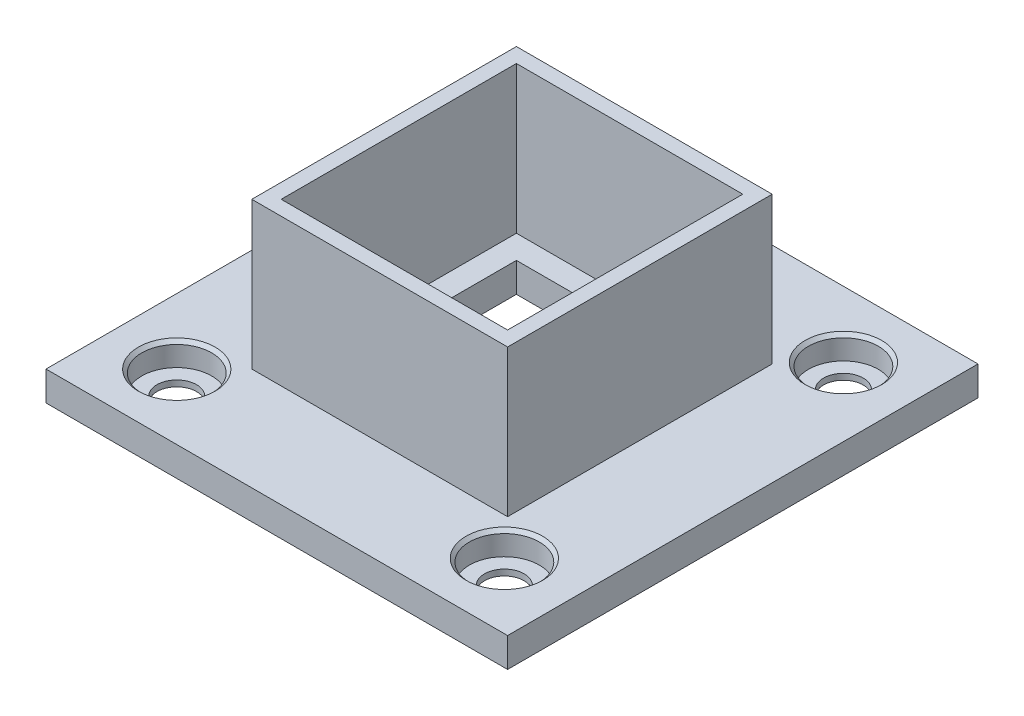
ISO-10303-21;
HEADER;
FILE_DESCRIPTION(('STEP AP214'),'2;1');
FILE_NAME('part.step','',(''),(''),'','','');
FILE_SCHEMA(('AUTOMOTIVE_DESIGN { 1 0 10303 214 1 1 1 1 }'));
ENDSEC;
DATA;
#1=APPLICATION_CONTEXT('core data for automotive mechanical design processes');
#2=APPLICATION_PROTOCOL_DEFINITION('international standard','automotive_design',2000,#1);
#3=PRODUCT_CONTEXT('',#1,'mechanical');
#4=PRODUCT('Part','Part','',(#3));
#5=PRODUCT_RELATED_PRODUCT_CATEGORY('part','',(#4));
#6=PRODUCT_DEFINITION_FORMATION('','',#4);
#7=PRODUCT_DEFINITION_CONTEXT('part definition',#1,'design');
#8=PRODUCT_DEFINITION('design','',#6,#7);
#9=PRODUCT_DEFINITION_SHAPE('','',#8);
#10=(LENGTH_UNIT() NAMED_UNIT(*) SI_UNIT(.MILLI.,.METRE.));
#11=(NAMED_UNIT(*) PLANE_ANGLE_UNIT() SI_UNIT($,.RADIAN.));
#12=(NAMED_UNIT(*) SI_UNIT($,.STERADIAN.) SOLID_ANGLE_UNIT());
#13=UNCERTAINTY_MEASURE_WITH_UNIT(LENGTH_MEASURE(1.E-05),#10,'distance_accuracy_value','');
#14=(GEOMETRIC_REPRESENTATION_CONTEXT(3) GLOBAL_UNCERTAINTY_ASSIGNED_CONTEXT((#13)) GLOBAL_UNIT_ASSIGNED_CONTEXT((#10,
#11,#12)) REPRESENTATION_CONTEXT('',''));
#15=CARTESIAN_POINT('',(0.,0.,0.));
#16=DIRECTION('',(0.,0.,1.));
#17=DIRECTION('',(1.,0.,0.));
#18=AXIS2_PLACEMENT_3D('',#15,#16,#17);
#19=CARTESIAN_POINT('',(0.,10.,0.));
#20=DIRECTION('',(0.,1.,0.));
#21=DIRECTION('',(0.,0.,1.));
#22=AXIS2_PLACEMENT_3D('',#19,#20,#21);
#23=PLANE('',#22);
#24=DIRECTION('',(0.,0.,1.));
#25=VECTOR('',#24,1.);
#26=CARTESIAN_POINT('',(-32.1468531468532,10.,-21.7167832167832));
#27=LINE('',#26,#25);
#28=CARTESIAN_POINT('',(-32.1468531468532,10.,-21.7167832167832));
#29=VERTEX_POINT('',#28);
#30=CARTESIAN_POINT('',(-32.1468531468532,10.,42.2832167832168));
#31=VERTEX_POINT('',#30);
#32=EDGE_CURVE('E305',#29,#31,#27,.T.);
#33=ORIENTED_EDGE('',*,*,#32,.F.);
#34=DIRECTION('',(-1.,0.,0.));
#35=VECTOR('',#34,1.);
#36=CARTESIAN_POINT('',(-32.1468531468532,10.,-21.7167832167832));
#37=LINE('',#36,#35);
#38=CARTESIAN_POINT('',(28.8531468531469,10.,-21.7167832167832));
#39=VERTEX_POINT('',#38);
#40=EDGE_CURVE('E295',#39,#29,#37,.T.);
#41=ORIENTED_EDGE('',*,*,#40,.F.);
#42=DIRECTION('',(0.,0.,-1.));
#43=VECTOR('',#42,1.);
#44=CARTESIAN_POINT('',(28.8531468531469,10.,-21.7167832167832));
#45=LINE('',#44,#43);
#46=CARTESIAN_POINT('',(28.8531468531469,10.,42.2832167832168));
#47=VERTEX_POINT('',#46);
#48=EDGE_CURVE('E310',#47,#39,#45,.T.);
#49=ORIENTED_EDGE('',*,*,#48,.F.);
#50=DIRECTION('',(1.,0.,0.));
#51=VECTOR('',#50,1.);
#52=CARTESIAN_POINT('',(-32.1468531468532,10.,42.2832167832168));
#53=LINE('',#52,#51);
#54=EDGE_CURVE('E307',#31,#47,#53,.T.);
#55=ORIENTED_EDGE('',*,*,#54,.F.);
#56=EDGE_LOOP('',(#33,#41,#49,#55));
#57=FACE_BOUND('',#56,.T.);
#58=DIRECTION('',(0.,0.,1.));
#59=VECTOR('',#58,1.);
#60=CARTESIAN_POINT('',(36.8531468531469,10.,-29.7167832167832));
#61=LINE('',#60,#59);
#62=CARTESIAN_POINT('',(36.8531468531469,10.,-29.7167832167832));
#63=VERTEX_POINT('',#62);
#64=CARTESIAN_POINT('',(36.8531468531469,10.,50.2832167832168));
#65=VERTEX_POINT('',#64);
#66=EDGE_CURVE('E204',#63,#65,#61,.T.);
#67=ORIENTED_EDGE('',*,*,#66,.F.);
#68=DIRECTION('',(1.,0.,0.));
#69=VECTOR('',#68,1.);
#70=CARTESIAN_POINT('',(-40.1468531468532,10.,-29.7167832167832));
#71=LINE('',#70,#69);
#72=CARTESIAN_POINT('',(-40.1468531468532,10.,-29.7167832167832));
#73=VERTEX_POINT('',#72);
#74=EDGE_CURVE('E178',#73,#63,#71,.T.);
#75=ORIENTED_EDGE('',*,*,#74,.F.);
#76=DIRECTION('',(0.,0.,1.));
#77=VECTOR('',#76,1.);
#78=CARTESIAN_POINT('',(-40.1468531468532,10.,-29.7167832167832));
#79=LINE('',#78,#77);
#80=CARTESIAN_POINT('',(-40.1468531468532,10.,50.2832167832168));
#81=VERTEX_POINT('',#80);
#82=EDGE_CURVE('E195',#73,#81,#79,.T.);
#83=ORIENTED_EDGE('',*,*,#82,.T.);
#84=DIRECTION('',(1.,0.,0.));
#85=VECTOR('',#84,1.);
#86=CARTESIAN_POINT('',(-40.1468531468532,10.,50.2832167832168));
#87=LINE('',#86,#85);
#88=EDGE_CURVE('E198',#81,#65,#87,.T.);
#89=ORIENTED_EDGE('',*,*,#88,.T.);
#90=EDGE_LOOP('',(#67,#75,#83,#89));
#91=FACE_BOUND('',#90,.T.);
#92=ADVANCED_FACE('F58',(#57,#91),#23,.T.);
#93=CARTESIAN_POINT('',(-80.1468531468532,10.,-69.7167832167832));
#94=DIRECTION('',(1.,0.,0.));
#95=DIRECTION('',(0.,0.,-1.));
#96=AXIS2_PLACEMENT_3D('',#93,#94,#95);
#97=PLANE('',#96);
#98=DIRECTION('',(0.,0.,1.));
#99=VECTOR('',#98,1.);
#100=CARTESIAN_POINT('',(-80.1468531468532,0.,-69.7167832167832));
#101=LINE('',#100,#99);
#102=CARTESIAN_POINT('',(-80.1468531468532,0.,-69.7167832167832));
#103=VERTEX_POINT('',#102);
#104=CARTESIAN_POINT('',(-80.1468531468531,0.,90.2832167832168));
#105=VERTEX_POINT('',#104);
#106=EDGE_CURVE('E317',#103,#105,#101,.T.);
#107=ORIENTED_EDGE('',*,*,#106,.T.);
#108=DIRECTION('',(0.,-1.,0.));
#109=VECTOR('',#108,1.);
#110=CARTESIAN_POINT('',(-80.1468531468531,10.,90.2832167832168));
#111=LINE('',#110,#109);
#112=CARTESIAN_POINT('',(-80.1468531468531,10.,90.2832167832168));
#113=VERTEX_POINT('',#112);
#114=EDGE_CURVE('E12',#113,#105,#111,.T.);
#115=ORIENTED_EDGE('',*,*,#114,.F.);
#116=DIRECTION('',(0.,0.,1.));
#117=VECTOR('',#116,1.);
#118=CARTESIAN_POINT('',(-80.1468531468532,10.,-69.7167832167832));
#119=LINE('',#118,#117);
#120=CARTESIAN_POINT('',(-80.1468531468532,10.,-69.7167832167832));
#121=VERTEX_POINT('',#120);
#122=EDGE_CURVE('E324',#121,#113,#119,.T.);
#123=ORIENTED_EDGE('',*,*,#122,.F.);
#124=DIRECTION('',(0.,-1.,0.));
#125=VECTOR('',#124,1.);
#126=CARTESIAN_POINT('',(-80.1468531468532,10.,-69.7167832167832));
#127=LINE('',#126,#125);
#128=EDGE_CURVE('E334',#121,#103,#127,.T.);
#129=ORIENTED_EDGE('',*,*,#128,.T.);
#130=EDGE_LOOP('',(#107,#115,#123,#129));
#131=FACE_BOUND('',#130,.T.);
#132=ADVANCED_FACE('F60',(#131),#97,.F.);
#133=CARTESIAN_POINT('',(-80.1468531468531,10.,90.2832167832168));
#134=DIRECTION('',(0.,0.,-1.));
#135=DIRECTION('',(-1.,0.,0.));
#136=AXIS2_PLACEMENT_3D('',#133,#134,#135);
#137=PLANE('',#136);
#138=DIRECTION('',(1.,0.,0.));
#139=VECTOR('',#138,1.);
#140=CARTESIAN_POINT('',(-80.1468531468531,0.,90.2832167832168));
#141=LINE('',#140,#139);
#142=CARTESIAN_POINT('',(76.8531468531469,0.,90.2832167832168));
#143=VERTEX_POINT('',#142);
#144=EDGE_CURVE('E337',#105,#143,#141,.T.);
#145=ORIENTED_EDGE('',*,*,#144,.T.);
#146=DIRECTION('',(0.,-1.,0.));
#147=VECTOR('',#146,1.);
#148=CARTESIAN_POINT('',(76.8531468531469,10.,90.2832167832168));
#149=LINE('',#148,#147);
#150=CARTESIAN_POINT('',(76.8531468531469,10.,90.2832167832168));
#151=VERTEX_POINT('',#150);
#152=EDGE_CURVE('E67',#151,#143,#149,.T.);
#153=ORIENTED_EDGE('',*,*,#152,.F.);
#154=DIRECTION('',(1.,0.,0.));
#155=VECTOR('',#154,1.);
#156=CARTESIAN_POINT('',(-80.1468531468531,10.,90.2832167832168));
#157=LINE('',#156,#155);
#158=EDGE_CURVE('E327',#113,#151,#157,.T.);
#159=ORIENTED_EDGE('',*,*,#158,.F.);
#160=ORIENTED_EDGE('',*,*,#114,.T.);
#161=EDGE_LOOP('',(#145,#153,#159,#160));
#162=FACE_BOUND('',#161,.T.);
#163=ADVANCED_FACE('F381',(#162),#137,.F.);
#164=CARTESIAN_POINT('',(76.8531468531469,10.,-69.7167832167832));
#165=DIRECTION('',(-1.,0.,0.));
#166=DIRECTION('',(0.,0.,1.));
#167=AXIS2_PLACEMENT_3D('',#164,#165,#166);
#168=PLANE('',#167);
#169=DIRECTION('',(0.,0.,-1.));
#170=VECTOR('',#169,1.);
#171=CARTESIAN_POINT('',(76.8531468531469,0.,-69.7167832167832));
#172=LINE('',#171,#170);
#173=CARTESIAN_POINT('',(76.8531468531469,0.,-69.7167832167832));
#174=VERTEX_POINT('',#173);
#175=EDGE_CURVE('E339',#143,#174,#172,.T.);
#176=ORIENTED_EDGE('',*,*,#175,.T.);
#177=DIRECTION('',(0.,-1.,0.));
#178=VECTOR('',#177,1.);
#179=CARTESIAN_POINT('',(76.8531468531469,10.,-69.7167832167832));
#180=LINE('',#179,#178);
#181=CARTESIAN_POINT('',(76.8531468531469,10.,-69.7167832167832));
#182=VERTEX_POINT('',#181);
#183=EDGE_CURVE('E344',#182,#174,#180,.T.);
#184=ORIENTED_EDGE('',*,*,#183,.F.);
#185=DIRECTION('',(0.,0.,-1.));
#186=VECTOR('',#185,1.);
#187=CARTESIAN_POINT('',(76.8531468531469,10.,-69.7167832167832));
#188=LINE('',#187,#186);
#189=EDGE_CURVE('E330',#151,#182,#188,.T.);
#190=ORIENTED_EDGE('',*,*,#189,.F.);
#191=ORIENTED_EDGE('',*,*,#152,.T.);
#192=EDGE_LOOP('',(#176,#184,#190,#191));
#193=FACE_BOUND('',#192,.T.);
#194=ADVANCED_FACE('F395',(#193),#168,.F.);
#195=CARTESIAN_POINT('',(-80.1468531468532,10.,-69.7167832167832));
#196=DIRECTION('',(0.,0.,1.));
#197=DIRECTION('',(1.,0.,0.));
#198=AXIS2_PLACEMENT_3D('',#195,#196,#197);
#199=PLANE('',#198);
#200=DIRECTION('',(-1.,0.,0.));
#201=VECTOR('',#200,1.);
#202=CARTESIAN_POINT('',(-80.1468531468532,0.,-69.7167832167832));
#203=LINE('',#202,#201);
#204=EDGE_CURVE('E328',#174,#103,#203,.T.);
#205=ORIENTED_EDGE('',*,*,#204,.T.);
#206=ORIENTED_EDGE('',*,*,#128,.F.);
#207=DIRECTION('',(-1.,0.,0.));
#208=VECTOR('',#207,1.);
#209=CARTESIAN_POINT('',(-80.1468531468532,10.,-69.7167832167832));
#210=LINE('',#209,#208);
#211=EDGE_CURVE('E332',#182,#121,#210,.T.);
#212=ORIENTED_EDGE('',*,*,#211,.F.);
#213=ORIENTED_EDGE('',*,*,#183,.T.);
#214=EDGE_LOOP('',(#205,#206,#212,#213));
#215=FACE_BOUND('',#214,.T.);
#216=ADVANCED_FACE('F388',(#215),#199,.F.);
#217=DIRECTION('',(1.,0.,0.));
#218=VECTOR('',#217,1.);
#219=CARTESIAN_POINT('',(0.,10.,-34.7167832167832));
#220=LINE('',#219,#218);
#221=CARTESIAN_POINT('',(-45.1468531468532,10.,-34.7167832167832));
#222=VERTEX_POINT('',#221);
#223=CARTESIAN_POINT('',(41.8531468531469,10.,-34.7167832167832));
#224=VERTEX_POINT('',#223);
#225=EDGE_CURVE('E210',#222,#224,#220,.T.);
#226=ORIENTED_EDGE('',*,*,#225,.T.);
#227=DIRECTION('',(0.,0.,1.));
#228=VECTOR('',#227,1.);
#229=CARTESIAN_POINT('',(41.8531468531469,10.,0.));
#230=LINE('',#229,#228);
#231=CARTESIAN_POINT('',(41.8531468531469,10.,55.2832167832168));
#232=VERTEX_POINT('',#231);
#233=EDGE_CURVE('E226',#224,#232,#230,.T.);
#234=ORIENTED_EDGE('',*,*,#233,.T.);
#235=DIRECTION('',(1.,0.,0.));
#236=VECTOR('',#235,1.);
#237=CARTESIAN_POINT('',(0.,10.,55.2832167832168));
#238=LINE('',#237,#236);
#239=CARTESIAN_POINT('',(-45.1468531468531,10.,55.2832167832168));
#240=VERTEX_POINT('',#239);
#241=EDGE_CURVE('E80',#240,#232,#238,.T.);
#242=ORIENTED_EDGE('',*,*,#241,.F.);
#243=DIRECTION('',(0.,0.,1.));
#244=VECTOR('',#243,1.);
#245=CARTESIAN_POINT('',(-45.1468531468532,10.,0.));
#246=LINE('',#245,#244);
#247=EDGE_CURVE('E75',#222,#240,#246,.T.);
#248=ORIENTED_EDGE('',*,*,#247,.F.);
#249=EDGE_LOOP('',(#226,#234,#242,#248));
#250=FACE_BOUND('',#249,.T.);
#251=CARTESIAN_POINT('',(-57.8778207814317,10.,-47.2493936206808));
#252=DIRECTION('',(0.,1.,0.));
#253=DIRECTION('',(0.,0.,1.));
#254=AXIS2_PLACEMENT_3D('',#251,#252,#253);
#255=CIRCLE('',#254,13.025);
#256=CARTESIAN_POINT('',(-57.8778207814317,10.,-34.2243936206808));
#257=VERTEX_POINT('',#256);
#258=EDGE_CURVE('E232',#257,#257,#255,.T.);
#259=ORIENTED_EDGE('',*,*,#258,.F.);
#260=EDGE_LOOP('',(#259));
#261=FACE_BOUND('',#260,.T.);
#262=CARTESIAN_POINT('',(53.5428002722703,10.,-47.2493936206808));
#263=DIRECTION('',(0.,1.,0.));
#264=DIRECTION('',(0.,0.,1.));
#265=AXIS2_PLACEMENT_3D('',#262,#263,#264);
#266=CIRCLE('',#265,13.025);
#267=CARTESIAN_POINT('',(53.5428002722703,10.,-34.2243936206808));
#268=VERTEX_POINT('',#267);
#269=EDGE_CURVE('E252',#268,#268,#266,.T.);
#270=ORIENTED_EDGE('',*,*,#269,.F.);
#271=EDGE_LOOP('',(#270));
#272=FACE_BOUND('',#271,.T.);
#273=CARTESIAN_POINT('',(53.5428002722703,10.,68.076155740978));
#274=DIRECTION('',(0.,1.,0.));
#275=DIRECTION('',(0.,0.,1.));
#276=AXIS2_PLACEMENT_3D('',#273,#274,#275);
#277=CIRCLE('',#276,13.025);
#278=CARTESIAN_POINT('',(53.5428002722703,10.,81.101155740978));
#279=VERTEX_POINT('',#278);
#280=EDGE_CURVE('E265',#279,#279,#277,.T.);
#281=ORIENTED_EDGE('',*,*,#280,.F.);
#282=EDGE_LOOP('',(#281));
#283=FACE_BOUND('',#282,.T.);
#284=CARTESIAN_POINT('',(-57.8778207814317,10.,68.076155740978));
#285=DIRECTION('',(0.,1.,0.));
#286=DIRECTION('',(0.,0.,1.));
#287=AXIS2_PLACEMENT_3D('',#284,#285,#286);
#288=CIRCLE('',#287,13.025);
#289=CARTESIAN_POINT('',(-57.8778207814317,10.,81.101155740978));
#290=VERTEX_POINT('',#289);
#291=EDGE_CURVE('E278',#290,#290,#288,.T.);
#292=ORIENTED_EDGE('',*,*,#291,.F.);
#293=EDGE_LOOP('',(#292));
#294=FACE_BOUND('',#293,.T.);
#295=ORIENTED_EDGE('',*,*,#122,.T.);
#296=ORIENTED_EDGE('',*,*,#158,.T.);
#297=ORIENTED_EDGE('',*,*,#189,.T.);
#298=ORIENTED_EDGE('',*,*,#211,.T.);
#299=EDGE_LOOP('',(#295,#296,#297,#298));
#300=FACE_BOUND('',#299,.T.);
#301=ADVANCED_FACE('F377',(#250,#261,#272,#283,#294,#300),#23,.T.);
#302=CARTESIAN_POINT('',(0.,0.,0.));
#303=DIRECTION('',(0.,1.,0.));
#304=DIRECTION('',(0.,0.,1.));
#305=AXIS2_PLACEMENT_3D('',#302,#303,#304);
#306=PLANE('',#305);
#307=CARTESIAN_POINT('',(-57.8778207814317,0.,-47.2493936206808));
#308=DIRECTION('',(0.,1.,0.));
#309=DIRECTION('',(0.,0.,1.));
#310=AXIS2_PLACEMENT_3D('',#307,#308,#309);
#311=CIRCLE('',#310,6.75);
#312=CARTESIAN_POINT('',(-57.8778207814317,0.,-40.4993936206808));
#313=VERTEX_POINT('',#312);
#314=EDGE_CURVE('E62',#313,#313,#311,.T.);
#315=ORIENTED_EDGE('',*,*,#314,.T.);
#316=EDGE_LOOP('',(#315));
#317=FACE_BOUND('',#316,.T.);
#318=CARTESIAN_POINT('',(53.5428002722703,0.,-47.2493936206808));
#319=DIRECTION('',(0.,1.,0.));
#320=DIRECTION('',(0.,0.,1.));
#321=AXIS2_PLACEMENT_3D('',#318,#319,#320);
#322=CIRCLE('',#321,6.75);
#323=CARTESIAN_POINT('',(53.5428002722703,0.,-40.4993936206808));
#324=VERTEX_POINT('',#323);
#325=EDGE_CURVE('E264',#324,#324,#322,.T.);
#326=ORIENTED_EDGE('',*,*,#325,.T.);
#327=EDGE_LOOP('',(#326));
#328=FACE_BOUND('',#327,.T.);
#329=CARTESIAN_POINT('',(53.5428002722703,0.,68.076155740978));
#330=DIRECTION('',(0.,1.,0.));
#331=DIRECTION('',(0.,0.,1.));
#332=AXIS2_PLACEMENT_3D('',#329,#330,#331);
#333=CIRCLE('',#332,6.75);
#334=CARTESIAN_POINT('',(53.5428002722703,0.,74.826155740978));
#335=VERTEX_POINT('',#334);
#336=EDGE_CURVE('E277',#335,#335,#333,.T.);
#337=ORIENTED_EDGE('',*,*,#336,.T.);
#338=EDGE_LOOP('',(#337));
#339=FACE_BOUND('',#338,.T.);
#340=CARTESIAN_POINT('',(-57.8778207814317,0.,68.076155740978));
#341=DIRECTION('',(0.,1.,0.));
#342=DIRECTION('',(0.,0.,1.));
#343=AXIS2_PLACEMENT_3D('',#340,#341,#342);
#344=CIRCLE('',#343,6.75);
#345=CARTESIAN_POINT('',(-57.8778207814317,0.,74.826155740978));
#346=VERTEX_POINT('',#345);
#347=EDGE_CURVE('E290',#346,#346,#344,.T.);
#348=ORIENTED_EDGE('',*,*,#347,.T.);
#349=EDGE_LOOP('',(#348));
#350=FACE_BOUND('',#349,.T.);
#351=DIRECTION('',(-1.,0.,0.));
#352=VECTOR('',#351,1.);
#353=CARTESIAN_POINT('',(-32.1468531468532,0.,-21.7167832167832));
#354=LINE('',#353,#352);
#355=CARTESIAN_POINT('',(28.8531468531469,0.,-21.7167832167832));
#356=VERTEX_POINT('',#355);
#357=CARTESIAN_POINT('',(-32.1468531468532,0.,-21.7167832167832));
#358=VERTEX_POINT('',#357);
#359=EDGE_CURVE('E301',#356,#358,#354,.T.);
#360=ORIENTED_EDGE('',*,*,#359,.T.);
#361=DIRECTION('',(0.,0.,1.));
#362=VECTOR('',#361,1.);
#363=CARTESIAN_POINT('',(-32.1468531468532,0.,-21.7167832167832));
#364=LINE('',#363,#362);
#365=CARTESIAN_POINT('',(-32.1468531468532,0.,42.2832167832168));
#366=VERTEX_POINT('',#365);
#367=EDGE_CURVE('E291',#358,#366,#364,.T.);
#368=ORIENTED_EDGE('',*,*,#367,.T.);
#369=DIRECTION('',(1.,0.,0.));
#370=VECTOR('',#369,1.);
#371=CARTESIAN_POINT('',(-32.1468531468532,0.,42.2832167832168));
#372=LINE('',#371,#370);
#373=CARTESIAN_POINT('',(28.8531468531469,0.,42.2832167832168));
#374=VERTEX_POINT('',#373);
#375=EDGE_CURVE('E294',#366,#374,#372,.T.);
#376=ORIENTED_EDGE('',*,*,#375,.T.);
#377=DIRECTION('',(0.,0.,-1.));
#378=VECTOR('',#377,1.);
#379=CARTESIAN_POINT('',(28.8531468531469,0.,-21.7167832167832));
#380=LINE('',#379,#378);
#381=EDGE_CURVE('E298',#374,#356,#380,.T.);
#382=ORIENTED_EDGE('',*,*,#381,.T.);
#383=EDGE_LOOP('',(#360,#368,#376,#382));
#384=FACE_BOUND('',#383,.T.);
#385=ORIENTED_EDGE('',*,*,#106,.F.);
#386=ORIENTED_EDGE('',*,*,#204,.F.);
#387=ORIENTED_EDGE('',*,*,#175,.F.);
#388=ORIENTED_EDGE('',*,*,#144,.F.);
#389=EDGE_LOOP('',(#385,#386,#387,#388));
#390=FACE_BOUND('',#389,.T.);
#391=ADVANCED_FACE('F355',(#317,#328,#339,#350,#384,#390),#306,.F.);
#392=CARTESIAN_POINT('',(-32.1468531468532,0.,-21.7167832167832));
#393=DIRECTION('',(-1.,0.,0.));
#394=DIRECTION('',(0.,0.,1.));
#395=AXIS2_PLACEMENT_3D('',#392,#393,#394);
#396=PLANE('',#395);
#397=ORIENTED_EDGE('',*,*,#32,.T.);
#398=DIRECTION('',(0.,1.,0.));
#399=VECTOR('',#398,1.);
#400=CARTESIAN_POINT('',(-32.1468531468532,0.,42.2832167832168));
#401=LINE('',#400,#399);
#402=EDGE_CURVE('E304',#366,#31,#401,.T.);
#403=ORIENTED_EDGE('',*,*,#402,.F.);
#404=ORIENTED_EDGE('',*,*,#367,.F.);
#405=DIRECTION('',(0.,1.,0.));
#406=VECTOR('',#405,1.);
#407=CARTESIAN_POINT('',(-32.1468531468532,0.,-21.7167832167832));
#408=LINE('',#407,#406);
#409=EDGE_CURVE('E315',#358,#29,#408,.T.);
#410=ORIENTED_EDGE('',*,*,#409,.T.);
#411=EDGE_LOOP('',(#397,#403,#404,#410));
#412=FACE_BOUND('',#411,.T.);
#413=ADVANCED_FACE('F393',(#412),#396,.F.);
#414=CARTESIAN_POINT('',(-32.1468531468532,0.,-21.7167832167832));
#415=DIRECTION('',(0.,0.,-1.));
#416=DIRECTION('',(-1.,0.,0.));
#417=AXIS2_PLACEMENT_3D('',#414,#415,#416);
#418=PLANE('',#417);
#419=ORIENTED_EDGE('',*,*,#40,.T.);
#420=ORIENTED_EDGE('',*,*,#409,.F.);
#421=ORIENTED_EDGE('',*,*,#359,.F.);
#422=DIRECTION('',(0.,1.,0.));
#423=VECTOR('',#422,1.);
#424=CARTESIAN_POINT('',(28.8531468531469,0.,-21.7167832167832));
#425=LINE('',#424,#423);
#426=EDGE_CURVE('E318',#356,#39,#425,.T.);
#427=ORIENTED_EDGE('',*,*,#426,.T.);
#428=EDGE_LOOP('',(#419,#420,#421,#427));
#429=FACE_BOUND('',#428,.T.);
#430=ADVANCED_FACE('F465',(#429),#418,.F.);
#431=CARTESIAN_POINT('',(28.8531468531469,0.,-21.7167832167832));
#432=DIRECTION('',(1.,0.,0.));
#433=DIRECTION('',(0.,0.,-1.));
#434=AXIS2_PLACEMENT_3D('',#431,#432,#433);
#435=PLANE('',#434);
#436=ORIENTED_EDGE('',*,*,#48,.T.);
#437=ORIENTED_EDGE('',*,*,#426,.F.);
#438=ORIENTED_EDGE('',*,*,#381,.F.);
#439=DIRECTION('',(0.,1.,0.));
#440=VECTOR('',#439,1.);
#441=CARTESIAN_POINT('',(28.8531468531469,0.,42.2832167832168));
#442=LINE('',#441,#440);
#443=EDGE_CURVE('E320',#374,#47,#442,.T.);
#444=ORIENTED_EDGE('',*,*,#443,.T.);
#445=EDGE_LOOP('',(#436,#437,#438,#444));
#446=FACE_BOUND('',#445,.T.);
#447=ADVANCED_FACE('F473',(#446),#435,.F.);
#448=CARTESIAN_POINT('',(-32.1468531468532,0.,42.2832167832168));
#449=DIRECTION('',(0.,0.,1.));
#450=DIRECTION('',(1.,0.,0.));
#451=AXIS2_PLACEMENT_3D('',#448,#449,#450);
#452=PLANE('',#451);
#453=ORIENTED_EDGE('',*,*,#54,.T.);
#454=ORIENTED_EDGE('',*,*,#443,.F.);
#455=ORIENTED_EDGE('',*,*,#375,.F.);
#456=ORIENTED_EDGE('',*,*,#402,.T.);
#457=EDGE_LOOP('',(#453,#454,#455,#456));
#458=FACE_BOUND('',#457,.T.);
#459=ADVANCED_FACE('F482',(#458),#452,.F.);
#460=CARTESIAN_POINT('',(-57.8778207814317,10.,68.076155740978));
#461=DIRECTION('',(0.,1.,0.));
#462=DIRECTION('',(0.,0.,1.));
#463=AXIS2_PLACEMENT_3D('',#460,#461,#462);
#464=CYLINDRICAL_SURFACE('',#463,6.75);
#465=CARTESIAN_POINT('',(-57.8778207814317,2.05,68.076155740978));
#466=DIRECTION('',(0.,1.,0.));
#467=DIRECTION('',(0.,0.,1.));
#468=AXIS2_PLACEMENT_3D('',#465,#466,#467);
#469=CIRCLE('',#468,6.75);
#470=CARTESIAN_POINT('',(-57.8778207814317,2.05,74.826155740978));
#471=VERTEX_POINT('',#470);
#472=EDGE_CURVE('E287',#471,#471,#469,.T.);
#473=ORIENTED_EDGE('',*,*,#472,.T.);
#474=EDGE_LOOP('',(#473));
#475=FACE_BOUND('',#474,.T.);
#476=ORIENTED_EDGE('',*,*,#347,.F.);
#477=EDGE_LOOP('',(#476));
#478=FACE_BOUND('',#477,.T.);
#479=ADVANCED_FACE('F490',(#475,#478),#464,.F.);
#480=CARTESIAN_POINT('',(-51.1278207814317,2.05,68.076155740978));
#481=DIRECTION('',(0.,-1.,0.));
#482=DIRECTION('',(0.,0.,-1.));
#483=AXIS2_PLACEMENT_3D('',#480,#481,#482);
#484=PLANE('',#483);
#485=ORIENTED_EDGE('',*,*,#472,.F.);
#486=EDGE_LOOP('',(#485));
#487=FACE_BOUND('',#486,.T.);
#488=CARTESIAN_POINT('',(-57.8778207814317,2.05,68.076155740978));
#489=DIRECTION('',(0.,1.,0.));
#490=DIRECTION('',(0.,0.,1.));
#491=AXIS2_PLACEMENT_3D('',#488,#489,#490);
#492=CIRCLE('',#491,11.89);
#493=CARTESIAN_POINT('',(-57.8778207814317,2.05,79.966155740978));
#494=VERTEX_POINT('',#493);
#495=EDGE_CURVE('E284',#494,#494,#492,.T.);
#496=ORIENTED_EDGE('',*,*,#495,.T.);
#497=EDGE_LOOP('',(#496));
#498=FACE_BOUND('',#497,.T.);
#499=ADVANCED_FACE('F498',(#487,#498),#484,.F.);
#500=CARTESIAN_POINT('',(-57.8778207814317,10.,68.076155740978));
#501=DIRECTION('',(0.,1.,0.));
#502=DIRECTION('',(0.,0.,1.));
#503=AXIS2_PLACEMENT_3D('',#500,#501,#502);
#504=CYLINDRICAL_SURFACE('',#503,11.89);
#505=ORIENTED_EDGE('',*,*,#495,.F.);
#506=EDGE_LOOP('',(#505));
#507=FACE_BOUND('',#506,.T.);
#508=CARTESIAN_POINT('',(-57.8778207814317,8.865,68.076155740978));
#509=DIRECTION('',(0.,1.,0.));
#510=DIRECTION('',(0.,0.,1.));
#511=AXIS2_PLACEMENT_3D('',#508,#509,#510);
#512=CIRCLE('',#511,11.89);
#513=CARTESIAN_POINT('',(-57.8778207814317,8.865,79.966155740978));
#514=VERTEX_POINT('',#513);
#515=EDGE_CURVE('E281',#514,#514,#512,.T.);
#516=ORIENTED_EDGE('',*,*,#515,.T.);
#517=EDGE_LOOP('',(#516));
#518=FACE_BOUND('',#517,.T.);
#519=ADVANCED_FACE('F507',(#507,#518),#504,.F.);
#520=CARTESIAN_POINT('',(-57.8778207814317,10.,68.076155740978));
#521=DIRECTION('',(0.,1.,0.));
#522=DIRECTION('',(0.,0.,1.));
#523=AXIS2_PLACEMENT_3D('',#520,#521,#522);
#524=CONICAL_SURFACE('',#523,13.025,0.785398163397451);
#525=ORIENTED_EDGE('',*,*,#515,.F.);
#526=EDGE_LOOP('',(#525));
#527=FACE_BOUND('',#526,.T.);
#528=ORIENTED_EDGE('',*,*,#291,.T.);
#529=EDGE_LOOP('',(#528));
#530=FACE_BOUND('',#529,.T.);
#531=ADVANCED_FACE('F516',(#527,#530),#524,.F.);
#532=CARTESIAN_POINT('',(53.5428002722703,10.,68.076155740978));
#533=DIRECTION('',(0.,1.,0.));
#534=DIRECTION('',(0.,0.,1.));
#535=AXIS2_PLACEMENT_3D('',#532,#533,#534);
#536=CYLINDRICAL_SURFACE('',#535,6.75);
#537=CARTESIAN_POINT('',(53.5428002722703,2.05,68.076155740978));
#538=DIRECTION('',(0.,1.,0.));
#539=DIRECTION('',(0.,0.,1.));
#540=AXIS2_PLACEMENT_3D('',#537,#538,#539);
#541=CIRCLE('',#540,6.75);
#542=CARTESIAN_POINT('',(53.5428002722703,2.05,74.826155740978));
#543=VERTEX_POINT('',#542);
#544=EDGE_CURVE('E274',#543,#543,#541,.T.);
#545=ORIENTED_EDGE('',*,*,#544,.T.);
#546=EDGE_LOOP('',(#545));
#547=FACE_BOUND('',#546,.T.);
#548=ORIENTED_EDGE('',*,*,#336,.F.);
#549=EDGE_LOOP('',(#548));
#550=FACE_BOUND('',#549,.T.);
#551=ADVANCED_FACE('F525',(#547,#550),#536,.F.);
#552=CARTESIAN_POINT('',(60.2928002722703,2.05,68.076155740978));
#553=DIRECTION('',(0.,-1.,0.));
#554=DIRECTION('',(0.,0.,-1.));
#555=AXIS2_PLACEMENT_3D('',#552,#553,#554);
#556=PLANE('',#555);
#557=ORIENTED_EDGE('',*,*,#544,.F.);
#558=EDGE_LOOP('',(#557));
#559=FACE_BOUND('',#558,.T.);
#560=CARTESIAN_POINT('',(53.5428002722703,2.05,68.076155740978));
#561=DIRECTION('',(0.,1.,0.));
#562=DIRECTION('',(0.,0.,1.));
#563=AXIS2_PLACEMENT_3D('',#560,#561,#562);
#564=CIRCLE('',#563,11.89);
#565=CARTESIAN_POINT('',(53.5428002722703,2.05,79.966155740978));
#566=VERTEX_POINT('',#565);
#567=EDGE_CURVE('E271',#566,#566,#564,.T.);
#568=ORIENTED_EDGE('',*,*,#567,.T.);
#569=EDGE_LOOP('',(#568));
#570=FACE_BOUND('',#569,.T.);
#571=ADVANCED_FACE('F534',(#559,#570),#556,.F.);
#572=CARTESIAN_POINT('',(53.5428002722703,10.,68.076155740978));
#573=DIRECTION('',(0.,1.,0.));
#574=DIRECTION('',(0.,0.,1.));
#575=AXIS2_PLACEMENT_3D('',#572,#573,#574);
#576=CYLINDRICAL_SURFACE('',#575,11.89);
#577=ORIENTED_EDGE('',*,*,#567,.F.);
#578=EDGE_LOOP('',(#577));
#579=FACE_BOUND('',#578,.T.);
#580=CARTESIAN_POINT('',(53.5428002722703,8.865,68.076155740978));
#581=DIRECTION('',(0.,1.,0.));
#582=DIRECTION('',(0.,0.,1.));
#583=AXIS2_PLACEMENT_3D('',#580,#581,#582);
#584=CIRCLE('',#583,11.89);
#585=CARTESIAN_POINT('',(53.5428002722703,8.865,79.966155740978));
#586=VERTEX_POINT('',#585);
#587=EDGE_CURVE('E268',#586,#586,#584,.T.);
#588=ORIENTED_EDGE('',*,*,#587,.T.);
#589=EDGE_LOOP('',(#588));
#590=FACE_BOUND('',#589,.T.);
#591=ADVANCED_FACE('F371',(#579,#590),#576,.F.);
#592=CARTESIAN_POINT('',(53.5428002722703,10.,68.076155740978));
#593=DIRECTION('',(0.,1.,0.));
#594=DIRECTION('',(0.,0.,1.));
#595=AXIS2_PLACEMENT_3D('',#592,#593,#594);
#596=CONICAL_SURFACE('',#595,13.025,0.785398163397447);
#597=ORIENTED_EDGE('',*,*,#587,.F.);
#598=EDGE_LOOP('',(#597));
#599=FACE_BOUND('',#598,.T.);
#600=ORIENTED_EDGE('',*,*,#280,.T.);
#601=EDGE_LOOP('',(#600));
#602=FACE_BOUND('',#601,.T.);
#603=ADVANCED_FACE('F361',(#599,#602),#596,.F.);
#604=CARTESIAN_POINT('',(53.5428002722703,10.,-47.2493936206808));
#605=DIRECTION('',(0.,1.,0.));
#606=DIRECTION('',(0.,0.,1.));
#607=AXIS2_PLACEMENT_3D('',#604,#605,#606);
#608=CYLINDRICAL_SURFACE('',#607,6.75);
#609=CARTESIAN_POINT('',(53.5428002722703,2.05,-47.2493936206808));
#610=DIRECTION('',(0.,1.,0.));
#611=DIRECTION('',(0.,0.,1.));
#612=AXIS2_PLACEMENT_3D('',#609,#610,#611);
#613=CIRCLE('',#612,6.75);
#614=CARTESIAN_POINT('',(53.5428002722703,2.05,-40.4993936206808));
#615=VERTEX_POINT('',#614);
#616=EDGE_CURVE('E261',#615,#615,#613,.T.);
#617=ORIENTED_EDGE('',*,*,#616,.T.);
#618=EDGE_LOOP('',(#617));
#619=FACE_BOUND('',#618,.T.);
#620=ORIENTED_EDGE('',*,*,#325,.F.);
#621=EDGE_LOOP('',(#620));
#622=FACE_BOUND('',#621,.T.);
#623=ADVANCED_FACE('F358',(#619,#622),#608,.F.);
#624=CARTESIAN_POINT('',(60.2928002722703,2.05,-47.2493936206808));
#625=DIRECTION('',(0.,-1.,0.));
#626=DIRECTION('',(0.,0.,-1.));
#627=AXIS2_PLACEMENT_3D('',#624,#625,#626);
#628=PLANE('',#627);
#629=ORIENTED_EDGE('',*,*,#616,.F.);
#630=EDGE_LOOP('',(#629));
#631=FACE_BOUND('',#630,.T.);
#632=CARTESIAN_POINT('',(53.5428002722703,2.05,-47.2493936206808));
#633=DIRECTION('',(0.,1.,0.));
#634=DIRECTION('',(0.,0.,1.));
#635=AXIS2_PLACEMENT_3D('',#632,#633,#634);
#636=CIRCLE('',#635,11.89);
#637=CARTESIAN_POINT('',(53.5428002722703,2.05,-35.3593936206808));
#638=VERTEX_POINT('',#637);
#639=EDGE_CURVE('E258',#638,#638,#636,.T.);
#640=ORIENTED_EDGE('',*,*,#639,.T.);
#641=EDGE_LOOP('',(#640));
#642=FACE_BOUND('',#641,.T.);
#643=ADVANCED_FACE('F360',(#631,#642),#628,.F.);
#644=CARTESIAN_POINT('',(53.5428002722703,10.,-47.2493936206808));
#645=DIRECTION('',(0.,1.,0.));
#646=DIRECTION('',(0.,0.,1.));
#647=AXIS2_PLACEMENT_3D('',#644,#645,#646);
#648=CYLINDRICAL_SURFACE('',#647,11.89);
#649=ORIENTED_EDGE('',*,*,#639,.F.);
#650=EDGE_LOOP('',(#649));
#651=FACE_BOUND('',#650,.T.);
#652=CARTESIAN_POINT('',(53.5428002722703,8.865,-47.2493936206808));
#653=DIRECTION('',(0.,1.,0.));
#654=DIRECTION('',(0.,0.,1.));
#655=AXIS2_PLACEMENT_3D('',#652,#653,#654);
#656=CIRCLE('',#655,11.89);
#657=CARTESIAN_POINT('',(53.5428002722703,8.865,-35.3593936206808));
#658=VERTEX_POINT('',#657);
#659=EDGE_CURVE('E255',#658,#658,#656,.T.);
#660=ORIENTED_EDGE('',*,*,#659,.T.);
#661=EDGE_LOOP('',(#660));
#662=FACE_BOUND('',#661,.T.);
#663=ADVANCED_FACE('F368',(#651,#662),#648,.F.);
#664=CARTESIAN_POINT('',(53.5428002722703,10.,-47.2493936206808));
#665=DIRECTION('',(0.,1.,0.));
#666=DIRECTION('',(0.,0.,1.));
#667=AXIS2_PLACEMENT_3D('',#664,#665,#666);
#668=CONICAL_SURFACE('',#667,13.025,0.785398163397447);
#669=ORIENTED_EDGE('',*,*,#659,.F.);
#670=EDGE_LOOP('',(#669));
#671=FACE_BOUND('',#670,.T.);
#672=ORIENTED_EDGE('',*,*,#269,.T.);
#673=EDGE_LOOP('',(#672));
#674=FACE_BOUND('',#673,.T.);
#675=ADVANCED_FACE('F573',(#671,#674),#668,.F.);
#676=CARTESIAN_POINT('',(-57.8778207814317,10.,-47.2493936206808));
#677=DIRECTION('',(0.,1.,0.));
#678=DIRECTION('',(0.,0.,1.));
#679=AXIS2_PLACEMENT_3D('',#676,#677,#678);
#680=CYLINDRICAL_SURFACE('',#679,6.75);
#681=CARTESIAN_POINT('',(-57.8778207814317,2.05,-47.2493936206808));
#682=DIRECTION('',(0.,1.,0.));
#683=DIRECTION('',(0.,0.,1.));
#684=AXIS2_PLACEMENT_3D('',#681,#682,#683);
#685=CIRCLE('',#684,6.75);
#686=CARTESIAN_POINT('',(-57.8778207814317,2.05,-40.4993936206808));
#687=VERTEX_POINT('',#686);
#688=EDGE_CURVE('E249',#687,#687,#685,.T.);
#689=ORIENTED_EDGE('',*,*,#688,.T.);
#690=EDGE_LOOP('',(#689));
#691=FACE_BOUND('',#690,.T.);
#692=ORIENTED_EDGE('',*,*,#314,.F.);
#693=EDGE_LOOP('',(#692));
#694=FACE_BOUND('',#693,.T.);
#695=ADVANCED_FACE('F582',(#691,#694),#680,.F.);
#696=CARTESIAN_POINT('',(-51.1278207814317,2.05,-47.2493936206808));
#697=DIRECTION('',(0.,-1.,0.));
#698=DIRECTION('',(0.,0.,-1.));
#699=AXIS2_PLACEMENT_3D('',#696,#697,#698);
#700=PLANE('',#699);
#701=ORIENTED_EDGE('',*,*,#688,.F.);
#702=EDGE_LOOP('',(#701));
#703=FACE_BOUND('',#702,.T.);
#704=CARTESIAN_POINT('',(-57.8778207814317,2.05,-47.2493936206808));
#705=DIRECTION('',(0.,1.,0.));
#706=DIRECTION('',(0.,0.,1.));
#707=AXIS2_PLACEMENT_3D('',#704,#705,#706);
#708=CIRCLE('',#707,11.89);
#709=CARTESIAN_POINT('',(-57.8778207814317,2.05,-35.3593936206808));
#710=VERTEX_POINT('',#709);
#711=EDGE_CURVE('E246',#710,#710,#708,.T.);
#712=ORIENTED_EDGE('',*,*,#711,.T.);
#713=EDGE_LOOP('',(#712));
#714=FACE_BOUND('',#713,.T.);
#715=ADVANCED_FACE('F591',(#703,#714),#700,.F.);
#716=CARTESIAN_POINT('',(-57.8778207814317,10.,-47.2493936206808));
#717=DIRECTION('',(0.,1.,0.));
#718=DIRECTION('',(0.,0.,1.));
#719=AXIS2_PLACEMENT_3D('',#716,#717,#718);
#720=CYLINDRICAL_SURFACE('',#719,11.89);
#721=ORIENTED_EDGE('',*,*,#711,.F.);
#722=EDGE_LOOP('',(#721));
#723=FACE_BOUND('',#722,.T.);
#724=CARTESIAN_POINT('',(-57.8778207814317,8.865,-47.2493936206808));
#725=DIRECTION('',(0.,1.,0.));
#726=DIRECTION('',(0.,0.,1.));
#727=AXIS2_PLACEMENT_3D('',#724,#725,#726);
#728=CIRCLE('',#727,11.89);
#729=CARTESIAN_POINT('',(-57.8778207814317,8.865,-35.3593936206808));
#730=VERTEX_POINT('',#729);
#731=EDGE_CURVE('E243',#730,#730,#728,.T.);
#732=ORIENTED_EDGE('',*,*,#731,.T.);
#733=EDGE_LOOP('',(#732));
#734=FACE_BOUND('',#733,.T.);
#735=ADVANCED_FACE('F600',(#723,#734),#720,.F.);
#736=CARTESIAN_POINT('',(-57.8778207814317,10.,-47.2493936206808));
#737=DIRECTION('',(0.,1.,0.));
#738=DIRECTION('',(0.,0.,1.));
#739=AXIS2_PLACEMENT_3D('',#736,#737,#738);
#740=CONICAL_SURFACE('',#739,13.025,0.785398163397451);
#741=ORIENTED_EDGE('',*,*,#731,.F.);
#742=EDGE_LOOP('',(#741));
#743=FACE_BOUND('',#742,.T.);
#744=ORIENTED_EDGE('',*,*,#258,.T.);
#745=EDGE_LOOP('',(#744));
#746=FACE_BOUND('',#745,.T.);
#747=ADVANCED_FACE('F609',(#743,#746),#740,.F.);
#748=CARTESIAN_POINT('',(0.,60.,-34.7167832167832));
#749=DIRECTION('',(0.,0.,-1.));
#750=DIRECTION('',(-1.,0.,0.));
#751=AXIS2_PLACEMENT_3D('',#748,#749,#750);
#752=PLANE('',#751);
#753=ORIENTED_EDGE('',*,*,#225,.F.);
#754=DIRECTION('',(0.,-1.,0.));
#755=VECTOR('',#754,1.);
#756=CARTESIAN_POINT('',(-45.1468531468532,60.,-34.7167832167832));
#757=LINE('',#756,#755);
#758=CARTESIAN_POINT('',(-45.1468531468532,60.,-34.7167832167832));
#759=VERTEX_POINT('',#758);
#760=EDGE_CURVE('E230',#759,#222,#757,.T.);
#761=ORIENTED_EDGE('',*,*,#760,.F.);
#762=DIRECTION('',(1.,0.,0.));
#763=VECTOR('',#762,1.);
#764=CARTESIAN_POINT('',(0.,60.,-34.7167832167832));
#765=LINE('',#764,#763);
#766=CARTESIAN_POINT('',(41.8531468531469,60.,-34.7167832167832));
#767=VERTEX_POINT('',#766);
#768=EDGE_CURVE('E214',#759,#767,#765,.T.);
#769=ORIENTED_EDGE('',*,*,#768,.T.);
#770=DIRECTION('',(0.,-1.,0.));
#771=VECTOR('',#770,1.);
#772=CARTESIAN_POINT('',(41.8531468531469,60.,-34.7167832167832));
#773=LINE('',#772,#771);
#774=EDGE_CURVE('E224',#767,#224,#773,.T.);
#775=ORIENTED_EDGE('',*,*,#774,.T.);
#776=EDGE_LOOP('',(#753,#761,#769,#775));
#777=FACE_BOUND('',#776,.T.);
#778=ADVANCED_FACE('F618',(#777),#752,.T.);
#779=CARTESIAN_POINT('',(-45.1468531468532,60.,0.));
#780=DIRECTION('',(1.,0.,0.));
#781=DIRECTION('',(0.,0.,-1.));
#782=AXIS2_PLACEMENT_3D('',#779,#780,#781);
#783=PLANE('',#782);
#784=ORIENTED_EDGE('',*,*,#247,.T.);
#785=DIRECTION('',(0.,-1.,0.));
#786=VECTOR('',#785,1.);
#787=CARTESIAN_POINT('',(-45.1468531468531,60.,55.2832167832168));
#788=LINE('',#787,#786);
#789=CARTESIAN_POINT('',(-45.1468531468531,60.,55.2832167832168));
#790=VERTEX_POINT('',#789);
#791=EDGE_CURVE('E233',#790,#240,#788,.T.);
#792=ORIENTED_EDGE('',*,*,#791,.F.);
#793=DIRECTION('',(0.,0.,1.));
#794=VECTOR('',#793,1.);
#795=CARTESIAN_POINT('',(-45.1468531468532,60.,0.));
#796=LINE('',#795,#794);
#797=EDGE_CURVE('E222',#759,#790,#796,.T.);
#798=ORIENTED_EDGE('',*,*,#797,.F.);
#799=ORIENTED_EDGE('',*,*,#760,.T.);
#800=EDGE_LOOP('',(#784,#792,#798,#799));
#801=FACE_BOUND('',#800,.T.);
#802=ADVANCED_FACE('F630',(#801),#783,.F.);
#803=CARTESIAN_POINT('',(0.,60.,55.2832167832168));
#804=DIRECTION('',(0.,0.,-1.));
#805=DIRECTION('',(-1.,0.,0.));
#806=AXIS2_PLACEMENT_3D('',#803,#804,#805);
#807=PLANE('',#806);
#808=ORIENTED_EDGE('',*,*,#241,.T.);
#809=DIRECTION('',(0.,-1.,0.));
#810=VECTOR('',#809,1.);
#811=CARTESIAN_POINT('',(41.8531468531469,60.,55.2832167832168));
#812=LINE('',#811,#810);
#813=CARTESIAN_POINT('',(41.8531468531469,60.,55.2832167832168));
#814=VERTEX_POINT('',#813);
#815=EDGE_CURVE('E236',#814,#232,#812,.T.);
#816=ORIENTED_EDGE('',*,*,#815,.F.);
#817=DIRECTION('',(1.,0.,0.));
#818=VECTOR('',#817,1.);
#819=CARTESIAN_POINT('',(0.,60.,55.2832167832168));
#820=LINE('',#819,#818);
#821=EDGE_CURVE('E220',#790,#814,#820,.T.);
#822=ORIENTED_EDGE('',*,*,#821,.F.);
#823=ORIENTED_EDGE('',*,*,#791,.T.);
#824=EDGE_LOOP('',(#808,#816,#822,#823));
#825=FACE_BOUND('',#824,.T.);
#826=ADVANCED_FACE('F639',(#825),#807,.F.);
#827=CARTESIAN_POINT('',(41.8531468531469,60.,0.));
#828=DIRECTION('',(1.,0.,0.));
#829=DIRECTION('',(0.,0.,-1.));
#830=AXIS2_PLACEMENT_3D('',#827,#828,#829);
#831=PLANE('',#830);
#832=ORIENTED_EDGE('',*,*,#233,.F.);
#833=ORIENTED_EDGE('',*,*,#774,.F.);
#834=DIRECTION('',(0.,0.,1.));
#835=VECTOR('',#834,1.);
#836=CARTESIAN_POINT('',(41.8531468531469,60.,0.));
#837=LINE('',#836,#835);
#838=EDGE_CURVE('E217',#767,#814,#837,.T.);
#839=ORIENTED_EDGE('',*,*,#838,.T.);
#840=ORIENTED_EDGE('',*,*,#815,.T.);
#841=EDGE_LOOP('',(#832,#833,#839,#840));
#842=FACE_BOUND('',#841,.T.);
#843=ADVANCED_FACE('F648',(#842),#831,.T.);
#844=CARTESIAN_POINT('',(0.,60.,0.));
#845=DIRECTION('',(0.,-1.,0.));
#846=DIRECTION('',(0.,0.,-1.));
#847=AXIS2_PLACEMENT_3D('',#844,#845,#846);
#848=PLANE('',#847);
#849=DIRECTION('',(0.,0.,1.));
#850=VECTOR('',#849,1.);
#851=CARTESIAN_POINT('',(-40.1468531468532,60.,-29.7167832167832));
#852=LINE('',#851,#850);
#853=CARTESIAN_POINT('',(-40.1468531468532,60.,-29.7167832167832));
#854=VERTEX_POINT('',#853);
#855=CARTESIAN_POINT('',(-40.1468531468532,60.,50.2832167832168));
#856=VERTEX_POINT('',#855);
#857=EDGE_CURVE('E183',#854,#856,#852,.T.);
#858=ORIENTED_EDGE('',*,*,#857,.F.);
#859=DIRECTION('',(1.,0.,0.));
#860=VECTOR('',#859,1.);
#861=CARTESIAN_POINT('',(-40.1468531468532,60.,-29.7167832167832));
#862=LINE('',#861,#860);
#863=CARTESIAN_POINT('',(36.8531468531469,60.,-29.7167832167832));
#864=VERTEX_POINT('',#863);
#865=EDGE_CURVE('E175',#854,#864,#862,.T.);
#866=ORIENTED_EDGE('',*,*,#865,.T.);
#867=DIRECTION('',(0.,0.,1.));
#868=VECTOR('',#867,1.);
#869=CARTESIAN_POINT('',(36.8531468531469,60.,-29.7167832167832));
#870=LINE('',#869,#868);
#871=CARTESIAN_POINT('',(36.8531468531469,60.,50.2832167832168));
#872=VERTEX_POINT('',#871);
#873=EDGE_CURVE('E186',#864,#872,#870,.T.);
#874=ORIENTED_EDGE('',*,*,#873,.T.);
#875=DIRECTION('',(1.,0.,0.));
#876=VECTOR('',#875,1.);
#877=CARTESIAN_POINT('',(-40.1468531468532,60.,50.2832167832168));
#878=LINE('',#877,#876);
#879=EDGE_CURVE('E191',#856,#872,#878,.T.);
#880=ORIENTED_EDGE('',*,*,#879,.F.);
#881=EDGE_LOOP('',(#858,#866,#874,#880));
#882=FACE_BOUND('',#881,.T.);
#883=ORIENTED_EDGE('',*,*,#768,.F.);
#884=ORIENTED_EDGE('',*,*,#797,.T.);
#885=ORIENTED_EDGE('',*,*,#821,.T.);
#886=ORIENTED_EDGE('',*,*,#838,.F.);
#887=EDGE_LOOP('',(#883,#884,#885,#886));
#888=FACE_BOUND('',#887,.T.);
#889=ADVANCED_FACE('F193',(#882,#888),#848,.F.);
#890=CARTESIAN_POINT('',(-40.1468531468532,60.,-29.7167832167832));
#891=DIRECTION('',(0.,0.,-1.));
#892=DIRECTION('',(-1.,0.,0.));
#893=AXIS2_PLACEMENT_3D('',#890,#891,#892);
#894=PLANE('',#893);
#895=ORIENTED_EDGE('',*,*,#74,.T.);
#896=DIRECTION('',(0.,-1.,0.));
#897=VECTOR('',#896,1.);
#898=CARTESIAN_POINT('',(36.8531468531469,60.,-29.7167832167832));
#899=LINE('',#898,#897);
#900=EDGE_CURVE('E171',#864,#63,#899,.T.);
#901=ORIENTED_EDGE('',*,*,#900,.F.);
#902=ORIENTED_EDGE('',*,*,#865,.F.);
#903=DIRECTION('',(0.,-1.,0.));
#904=VECTOR('',#903,1.);
#905=CARTESIAN_POINT('',(-40.1468531468532,60.,-29.7167832167832));
#906=LINE('',#905,#904);
#907=EDGE_CURVE('E208',#854,#73,#906,.T.);
#908=ORIENTED_EDGE('',*,*,#907,.T.);
#909=EDGE_LOOP('',(#895,#901,#902,#908));
#910=FACE_BOUND('',#909,.T.);
#911=ADVANCED_FACE('F173',(#910),#894,.F.);
#912=CARTESIAN_POINT('',(-40.1468531468532,60.,-29.7167832167832));
#913=DIRECTION('',(1.,0.,0.));
#914=DIRECTION('',(0.,0.,-1.));
#915=AXIS2_PLACEMENT_3D('',#912,#913,#914);
#916=PLANE('',#915);
#917=ORIENTED_EDGE('',*,*,#82,.F.);
#918=ORIENTED_EDGE('',*,*,#907,.F.);
#919=ORIENTED_EDGE('',*,*,#857,.T.);
#920=DIRECTION('',(0.,-1.,0.));
#921=VECTOR('',#920,1.);
#922=CARTESIAN_POINT('',(-40.1468531468532,60.,50.2832167832168));
#923=LINE('',#922,#921);
#924=EDGE_CURVE('E211',#856,#81,#923,.T.);
#925=ORIENTED_EDGE('',*,*,#924,.T.);
#926=EDGE_LOOP('',(#917,#918,#919,#925));
#927=FACE_BOUND('',#926,.T.);
#928=ADVANCED_FACE('F672',(#927),#916,.T.);
#929=CARTESIAN_POINT('',(-40.1468531468532,60.,50.2832167832168));
#930=DIRECTION('',(0.,0.,-1.));
#931=DIRECTION('',(-1.,0.,0.));
#932=AXIS2_PLACEMENT_3D('',#929,#930,#931);
#933=PLANE('',#932);
#934=ORIENTED_EDGE('',*,*,#88,.F.);
#935=ORIENTED_EDGE('',*,*,#924,.F.);
#936=ORIENTED_EDGE('',*,*,#879,.T.);
#937=DIRECTION('',(0.,-1.,0.));
#938=VECTOR('',#937,1.);
#939=CARTESIAN_POINT('',(36.8531468531469,60.,50.2832167832168));
#940=LINE('',#939,#938);
#941=EDGE_CURVE('E182',#872,#65,#940,.T.);
#942=ORIENTED_EDGE('',*,*,#941,.T.);
#943=EDGE_LOOP('',(#934,#935,#936,#942));
#944=FACE_BOUND('',#943,.T.);
#945=ADVANCED_FACE('F680',(#944),#933,.T.);
#946=CARTESIAN_POINT('',(36.8531468531469,60.,-29.7167832167832));
#947=DIRECTION('',(1.,0.,0.));
#948=DIRECTION('',(0.,0.,-1.));
#949=AXIS2_PLACEMENT_3D('',#946,#947,#948);
#950=PLANE('',#949);
#951=ORIENTED_EDGE('',*,*,#66,.T.);
#952=ORIENTED_EDGE('',*,*,#941,.F.);
#953=ORIENTED_EDGE('',*,*,#873,.F.);
#954=ORIENTED_EDGE('',*,*,#900,.T.);
#955=EDGE_LOOP('',(#951,#952,#953,#954));
#956=FACE_BOUND('',#955,.T.);
#957=ADVANCED_FACE('F187',(#956),#950,.F.);
#958=CLOSED_SHELL('',(#92,#132,#163,#194,#216,#301,#391,#413,#430,#447,#459,#479,#499,#519,#531,
#551,#571,#591,#603,#623,#643,#663,#675,#695,#715,#735,#747,#778,#802,#826,#843,#889,#911,#928,
#945,#957));
#959=MANIFOLD_SOLID_BREP('B2',#958);
#960=ADVANCED_BREP_SHAPE_REPRESENTATION('',(#18,#959),#14);
#961=SHAPE_DEFINITION_REPRESENTATION(#9,#960);
ENDSEC;
END-ISO-10303-21;
